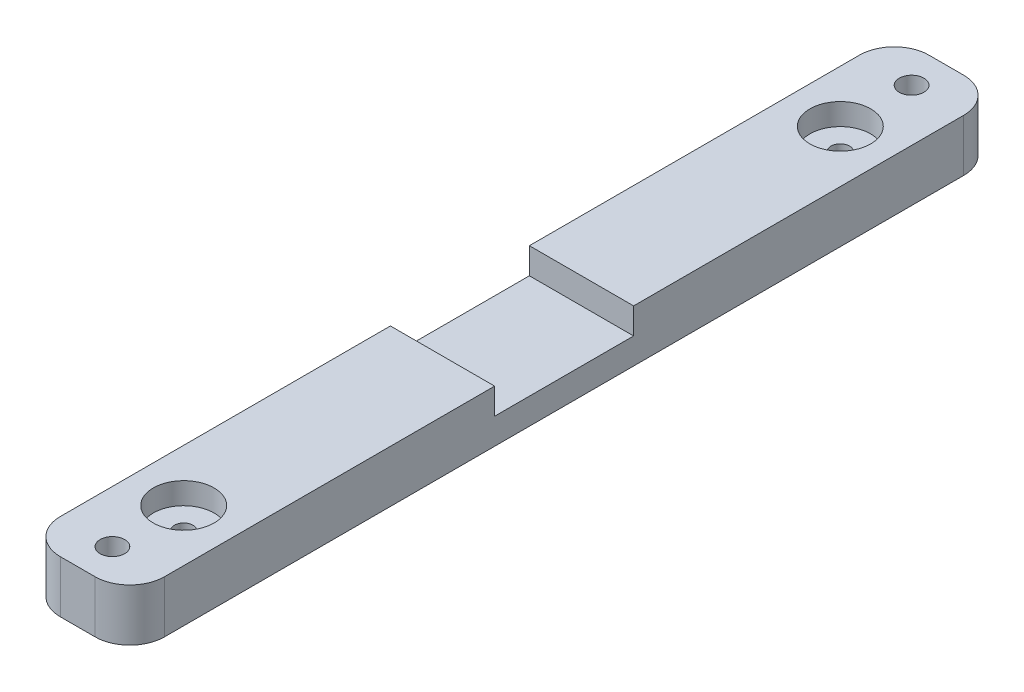
ISO-10303-21;
HEADER;
FILE_DESCRIPTION(('STEP AP214'),'2;1');
FILE_NAME('part.step','',(''),(''),'','','');
FILE_SCHEMA(('AUTOMOTIVE_DESIGN { 1 0 10303 214 1 1 1 1 }'));
ENDSEC;
DATA;
#1=APPLICATION_CONTEXT('core data for automotive mechanical design processes');
#2=APPLICATION_PROTOCOL_DEFINITION('international standard','automotive_design',2000,#1);
#3=PRODUCT_CONTEXT('',#1,'mechanical');
#4=PRODUCT('Part','Part','',(#3));
#5=PRODUCT_RELATED_PRODUCT_CATEGORY('part','',(#4));
#6=PRODUCT_DEFINITION_FORMATION('','',#4);
#7=PRODUCT_DEFINITION_CONTEXT('part definition',#1,'design');
#8=PRODUCT_DEFINITION('design','',#6,#7);
#9=PRODUCT_DEFINITION_SHAPE('','',#8);
#10=(LENGTH_UNIT() NAMED_UNIT(*) SI_UNIT(.MILLI.,.METRE.));
#11=(NAMED_UNIT(*) PLANE_ANGLE_UNIT() SI_UNIT($,.RADIAN.));
#12=(NAMED_UNIT(*) SI_UNIT($,.STERADIAN.) SOLID_ANGLE_UNIT());
#13=UNCERTAINTY_MEASURE_WITH_UNIT(LENGTH_MEASURE(1.E-05),#10,'distance_accuracy_value','');
#14=(GEOMETRIC_REPRESENTATION_CONTEXT(3) GLOBAL_UNCERTAINTY_ASSIGNED_CONTEXT((#13)) GLOBAL_UNIT_ASSIGNED_CONTEXT((#10,
#11,#12)) REPRESENTATION_CONTEXT('',''));
#15=CARTESIAN_POINT('',(0.,0.,0.));
#16=DIRECTION('',(0.,0.,1.));
#17=DIRECTION('',(1.,0.,0.));
#18=AXIS2_PLACEMENT_3D('',#15,#16,#17);
#19=CARTESIAN_POINT('',(0.,4.7625,-60.000000015));
#20=DIRECTION('',(0.,1.,0.));
#21=DIRECTION('',(0.,0.,1.));
#22=AXIS2_PLACEMENT_3D('',#19,#20,#21);
#23=CYLINDRICAL_SURFACE('',#22,1.69999999999999);
#24=CARTESIAN_POINT('',(0.,-4.7625,-60.000000015));
#25=DIRECTION('',(0.,1.,0.));
#26=DIRECTION('',(0.,0.,1.));
#27=AXIS2_PLACEMENT_3D('',#24,#25,#26);
#28=CIRCLE('',#27,1.7);
#29=CARTESIAN_POINT('',(0.,-4.7625,-58.300000015));
#30=VERTEX_POINT('',#29);
#31=EDGE_CURVE('E256',#30,#30,#28,.T.);
#32=ORIENTED_EDGE('',*,*,#31,.F.);
#33=EDGE_LOOP('',(#32));
#34=FACE_BOUND('',#33,.T.);
#35=CARTESIAN_POINT('',(0.,0.79375,-60.000000015));
#36=DIRECTION('',(0.,1.,0.));
#37=DIRECTION('',(0.,0.,1.));
#38=AXIS2_PLACEMENT_3D('',#35,#36,#37);
#39=CIRCLE('',#38,1.69999999999999);
#40=CARTESIAN_POINT('',(0.,0.79375,-58.300000015));
#41=VERTEX_POINT('',#40);
#42=EDGE_CURVE('E183',#41,#41,#39,.F.);
#43=ORIENTED_EDGE('',*,*,#42,.F.);
#44=EDGE_LOOP('',(#43));
#45=FACE_BOUND('',#44,.T.);
#46=ADVANCED_FACE('F35',(#34,#45),#23,.F.);
#47=CARTESIAN_POINT('',(0.,4.7625,60.000000015));
#48=DIRECTION('',(0.,1.,0.));
#49=DIRECTION('',(0.,0.,1.));
#50=AXIS2_PLACEMENT_3D('',#47,#48,#49);
#51=CYLINDRICAL_SURFACE('',#50,1.69999999999999);
#52=CARTESIAN_POINT('',(0.,-4.7625,60.000000015));
#53=DIRECTION('',(0.,1.,0.));
#54=DIRECTION('',(0.,0.,1.));
#55=AXIS2_PLACEMENT_3D('',#52,#53,#54);
#56=CIRCLE('',#55,1.7);
#57=CARTESIAN_POINT('',(0.,-4.7625,61.700000015));
#58=VERTEX_POINT('',#57);
#59=EDGE_CURVE('E187',#58,#58,#56,.T.);
#60=ORIENTED_EDGE('',*,*,#59,.F.);
#61=EDGE_LOOP('',(#60));
#62=FACE_BOUND('',#61,.T.);
#63=CARTESIAN_POINT('',(0.,0.79375,60.000000015));
#64=DIRECTION('',(0.,1.,0.));
#65=DIRECTION('',(0.,0.,1.));
#66=AXIS2_PLACEMENT_3D('',#63,#64,#65);
#67=CIRCLE('',#66,1.69999999999999);
#68=CARTESIAN_POINT('',(0.,0.79375,61.700000015));
#69=VERTEX_POINT('',#68);
#70=EDGE_CURVE('E180',#69,#69,#67,.F.);
#71=ORIENTED_EDGE('',*,*,#70,.F.);
#72=EDGE_LOOP('',(#71));
#73=FACE_BOUND('',#72,.T.);
#74=ADVANCED_FACE('F311',(#62,#73),#51,.F.);
#75=CARTESIAN_POINT('',(-9.525,4.7625,79.375));
#76=DIRECTION('',(0.,-1.,0.));
#77=DIRECTION('',(0.,0.,-1.));
#78=AXIS2_PLACEMENT_3D('',#75,#76,#77);
#79=PLANE('',#78);
#80=CARTESIAN_POINT('',(0.,4.7625,-73.025));
#81=DIRECTION('',(0.,1.,0.));
#82=DIRECTION('',(0.,0.,1.));
#83=AXIS2_PLACEMENT_3D('',#80,#81,#82);
#84=CIRCLE('',#83,2.2479);
#85=CARTESIAN_POINT('',(0.,4.7625,-70.7771));
#86=VERTEX_POINT('',#85);
#87=EDGE_CURVE('E277',#86,#86,#84,.T.);
#88=ORIENTED_EDGE('',*,*,#87,.F.);
#89=EDGE_LOOP('',(#88));
#90=FACE_BOUND('',#89,.T.);
#91=CARTESIAN_POINT('',(0.,4.7625,-60.000000015));
#92=DIRECTION('',(0.,1.,0.));
#93=DIRECTION('',(0.,0.,1.));
#94=AXIS2_PLACEMENT_3D('',#91,#92,#93);
#95=CIRCLE('',#94,5.55625);
#96=CARTESIAN_POINT('',(0.,4.7625,-54.443750015));
#97=VERTEX_POINT('',#96);
#98=EDGE_CURVE('E263',#97,#97,#95,.T.);
#99=ORIENTED_EDGE('',*,*,#98,.F.);
#100=EDGE_LOOP('',(#99));
#101=FACE_BOUND('',#100,.T.);
#102=DIRECTION('',(0.,0.,-1.));
#103=VECTOR('',#102,1.);
#104=CARTESIAN_POINT('',(9.525,4.7625,79.375));
#105=LINE('',#104,#103);
#106=CARTESIAN_POINT('',(9.525,4.7625,-12.7));
#107=VERTEX_POINT('',#106);
#108=CARTESIAN_POINT('',(9.525,4.7625,-73.0249999999999));
#109=VERTEX_POINT('',#108);
#110=EDGE_CURVE('E176',#107,#109,#105,.T.);
#111=ORIENTED_EDGE('',*,*,#110,.T.);
#112=CARTESIAN_POINT('',(3.175,4.7625,-73.025));
#113=DIRECTION('',(0.,-1.,0.));
#114=DIRECTION('',(0.,0.,-1.));
#115=AXIS2_PLACEMENT_3D('',#112,#113,#114);
#116=CIRCLE('',#115,6.35);
#117=CARTESIAN_POINT('',(3.175,4.7625,-79.375));
#118=VERTEX_POINT('',#117);
#119=EDGE_CURVE('E194',#109,#118,#116,.F.);
#120=ORIENTED_EDGE('',*,*,#119,.T.);
#121=DIRECTION('',(-1.,0.,0.));
#122=VECTOR('',#121,1.);
#123=CARTESIAN_POINT('',(-9.525,4.7625,-79.375));
#124=LINE('',#123,#122);
#125=CARTESIAN_POINT('',(-3.175,4.7625,-79.375));
#126=VERTEX_POINT('',#125);
#127=EDGE_CURVE('E163',#118,#126,#124,.T.);
#128=ORIENTED_EDGE('',*,*,#127,.T.);
#129=CARTESIAN_POINT('',(-3.175,4.7625,-73.025));
#130=DIRECTION('',(0.,-1.,0.));
#131=DIRECTION('',(0.,0.,-1.));
#132=AXIS2_PLACEMENT_3D('',#129,#130,#131);
#133=CIRCLE('',#132,6.35);
#134=CARTESIAN_POINT('',(-9.525,4.7625,-73.0249999999999));
#135=VERTEX_POINT('',#134);
#136=EDGE_CURVE('E192',#126,#135,#133,.F.);
#137=ORIENTED_EDGE('',*,*,#136,.T.);
#138=DIRECTION('',(0.,0.,-1.));
#139=VECTOR('',#138,1.);
#140=CARTESIAN_POINT('',(-9.525,4.7625,79.375));
#141=LINE('',#140,#139);
#142=CARTESIAN_POINT('',(-9.525,4.7625,-12.7));
#143=VERTEX_POINT('',#142);
#144=EDGE_CURVE('E174',#143,#135,#141,.T.);
#145=ORIENTED_EDGE('',*,*,#144,.F.);
#146=DIRECTION('',(-1.,0.,0.));
#147=VECTOR('',#146,1.);
#148=CARTESIAN_POINT('',(-9.525,4.7625,-12.7));
#149=LINE('',#148,#147);
#150=EDGE_CURVE('E145',#107,#143,#149,.T.);
#151=ORIENTED_EDGE('',*,*,#150,.F.);
#152=EDGE_LOOP('',(#111,#120,#128,#137,#145,#151));
#153=FACE_BOUND('',#152,.T.);
#154=ADVANCED_FACE('F239',(#90,#101,#153),#79,.F.);
#155=CARTESIAN_POINT('',(9.525,-4.7625,79.375));
#156=DIRECTION('',(-1.,0.,0.));
#157=DIRECTION('',(0.,0.,1.));
#158=AXIS2_PLACEMENT_3D('',#155,#156,#157);
#159=PLANE('',#158);
#160=DIRECTION('',(0.,0.,-1.));
#161=VECTOR('',#160,1.);
#162=CARTESIAN_POINT('',(9.525,-4.7625,79.375));
#163=LINE('',#162,#161);
#164=CARTESIAN_POINT('',(9.525,-4.7625,73.025));
#165=VERTEX_POINT('',#164);
#166=CARTESIAN_POINT('',(9.525,-4.7625,-73.0249999999999));
#167=VERTEX_POINT('',#166);
#168=EDGE_CURVE('E162',#165,#167,#163,.T.);
#169=ORIENTED_EDGE('',*,*,#168,.T.);
#170=DIRECTION('',(0.,1.,0.));
#171=VECTOR('',#170,1.);
#172=CARTESIAN_POINT('',(9.525,4.7625,-73.025));
#173=LINE('',#172,#171);
#174=EDGE_CURVE('E189',#167,#109,#173,.T.);
#175=ORIENTED_EDGE('',*,*,#174,.T.);
#176=ORIENTED_EDGE('',*,*,#110,.F.);
#177=DIRECTION('',(0.,1.,0.));
#178=VECTOR('',#177,1.);
#179=CARTESIAN_POINT('',(9.525,0.,-12.7));
#180=LINE('',#179,#178);
#181=CARTESIAN_POINT('',(9.525,0.,-12.7));
#182=VERTEX_POINT('',#181);
#183=EDGE_CURVE('E151',#182,#107,#180,.T.);
#184=ORIENTED_EDGE('',*,*,#183,.F.);
#185=DIRECTION('',(0.,0.,-1.));
#186=VECTOR('',#185,1.);
#187=CARTESIAN_POINT('',(9.525,0.,12.7));
#188=LINE('',#187,#186);
#189=CARTESIAN_POINT('',(9.525,0.,12.7));
#190=VERTEX_POINT('',#189);
#191=EDGE_CURVE('E135',#190,#182,#188,.T.);
#192=ORIENTED_EDGE('',*,*,#191,.F.);
#193=DIRECTION('',(0.,1.,0.));
#194=VECTOR('',#193,1.);
#195=CARTESIAN_POINT('',(9.525,0.,12.7));
#196=LINE('',#195,#194);
#197=CARTESIAN_POINT('',(9.525,4.7625,12.7));
#198=VERTEX_POINT('',#197);
#199=EDGE_CURVE('E132',#190,#198,#196,.T.);
#200=ORIENTED_EDGE('',*,*,#199,.T.);
#201=CARTESIAN_POINT('',(9.525,4.7625,73.025));
#202=VERTEX_POINT('',#201);
#203=EDGE_CURVE('E177',#202,#198,#105,.T.);
#204=ORIENTED_EDGE('',*,*,#203,.F.);
#205=DIRECTION('',(0.,1.,0.));
#206=VECTOR('',#205,1.);
#207=CARTESIAN_POINT('',(9.525,-4.7625,73.025));
#208=LINE('',#207,#206);
#209=EDGE_CURVE('E179',#202,#165,#208,.F.);
#210=ORIENTED_EDGE('',*,*,#209,.T.);
#211=EDGE_LOOP('',(#169,#175,#176,#184,#192,#200,#204,#210));
#212=FACE_BOUND('',#211,.T.);
#213=ADVANCED_FACE('F225',(#212),#159,.F.);
#214=CARTESIAN_POINT('',(0.,4.7625,73.025));
#215=DIRECTION('',(0.,1.,0.));
#216=DIRECTION('',(0.,0.,1.));
#217=AXIS2_PLACEMENT_3D('',#214,#215,#216);
#218=CIRCLE('',#217,2.2479);
#219=CARTESIAN_POINT('',(0.,4.7625,75.2729));
#220=VERTEX_POINT('',#219);
#221=EDGE_CURVE('E283',#220,#220,#218,.T.);
#222=ORIENTED_EDGE('',*,*,#221,.F.);
#223=EDGE_LOOP('',(#222));
#224=FACE_BOUND('',#223,.T.);
#225=CARTESIAN_POINT('',(0.,4.7625,60.000000015));
#226=DIRECTION('',(0.,1.,0.));
#227=DIRECTION('',(0.,0.,1.));
#228=AXIS2_PLACEMENT_3D('',#225,#226,#227);
#229=CIRCLE('',#228,5.55625);
#230=CARTESIAN_POINT('',(0.,4.7625,65.556250015));
#231=VERTEX_POINT('',#230);
#232=EDGE_CURVE('E270',#231,#231,#229,.T.);
#233=ORIENTED_EDGE('',*,*,#232,.F.);
#234=EDGE_LOOP('',(#233));
#235=FACE_BOUND('',#234,.T.);
#236=DIRECTION('',(-1.,0.,0.));
#237=VECTOR('',#236,1.);
#238=CARTESIAN_POINT('',(-9.525,4.7625,79.375));
#239=LINE('',#238,#237);
#240=CARTESIAN_POINT('',(3.175,4.7625,79.375));
#241=VERTEX_POINT('',#240);
#242=CARTESIAN_POINT('',(-3.175,4.7625,79.375));
#243=VERTEX_POINT('',#242);
#244=EDGE_CURVE('E156',#241,#243,#239,.T.);
#245=ORIENTED_EDGE('',*,*,#244,.F.);
#246=CARTESIAN_POINT('',(3.175,4.7625,73.025));
#247=DIRECTION('',(0.,-1.,0.));
#248=DIRECTION('',(0.,0.,-1.));
#249=AXIS2_PLACEMENT_3D('',#246,#247,#248);
#250=CIRCLE('',#249,6.35);
#251=EDGE_CURVE('E11',#241,#202,#250,.F.);
#252=ORIENTED_EDGE('',*,*,#251,.T.);
#253=ORIENTED_EDGE('',*,*,#203,.T.);
#254=DIRECTION('',(1.,0.,0.));
#255=VECTOR('',#254,1.);
#256=CARTESIAN_POINT('',(-9.525,4.7625,12.7));
#257=LINE('',#256,#255);
#258=CARTESIAN_POINT('',(-9.525,4.7625,12.7));
#259=VERTEX_POINT('',#258);
#260=EDGE_CURVE('E255',#259,#198,#257,.T.);
#261=ORIENTED_EDGE('',*,*,#260,.F.);
#262=CARTESIAN_POINT('',(-9.525,4.7625,73.025));
#263=VERTEX_POINT('',#262);
#264=EDGE_CURVE('E149',#263,#259,#141,.T.);
#265=ORIENTED_EDGE('',*,*,#264,.F.);
#266=CARTESIAN_POINT('',(-3.175,4.7625,73.025));
#267=DIRECTION('',(0.,-1.,0.));
#268=DIRECTION('',(0.,0.,-1.));
#269=AXIS2_PLACEMENT_3D('',#266,#267,#268);
#270=CIRCLE('',#269,6.35);
#271=EDGE_CURVE('E43',#263,#243,#270,.F.);
#272=ORIENTED_EDGE('',*,*,#271,.T.);
#273=EDGE_LOOP('',(#245,#252,#253,#261,#265,#272));
#274=FACE_BOUND('',#273,.T.);
#275=ADVANCED_FACE('F222',(#224,#235,#274),#79,.F.);
#276=CARTESIAN_POINT('',(-9.525,-4.7625,79.375));
#277=DIRECTION('',(1.,0.,0.));
#278=DIRECTION('',(0.,0.,-1.));
#279=AXIS2_PLACEMENT_3D('',#276,#277,#278);
#280=PLANE('',#279);
#281=ORIENTED_EDGE('',*,*,#144,.T.);
#282=DIRECTION('',(0.,-1.,0.));
#283=VECTOR('',#282,1.);
#284=CARTESIAN_POINT('',(-9.525,-4.7625,-73.025));
#285=LINE('',#284,#283);
#286=CARTESIAN_POINT('',(-9.525,-4.7625,-73.0249999999999));
#287=VERTEX_POINT('',#286);
#288=EDGE_CURVE('E210',#135,#287,#285,.T.);
#289=ORIENTED_EDGE('',*,*,#288,.T.);
#290=DIRECTION('',(0.,0.,-1.));
#291=VECTOR('',#290,1.);
#292=CARTESIAN_POINT('',(-9.525,-4.7625,79.375));
#293=LINE('',#292,#291);
#294=CARTESIAN_POINT('',(-9.525,-4.7625,73.025));
#295=VERTEX_POINT('',#294);
#296=EDGE_CURVE('E171',#295,#287,#293,.T.);
#297=ORIENTED_EDGE('',*,*,#296,.F.);
#298=DIRECTION('',(0.,-1.,0.));
#299=VECTOR('',#298,1.);
#300=CARTESIAN_POINT('',(-9.525,-4.7625,73.025));
#301=LINE('',#300,#299);
#302=EDGE_CURVE('E208',#295,#263,#301,.F.);
#303=ORIENTED_EDGE('',*,*,#302,.T.);
#304=ORIENTED_EDGE('',*,*,#264,.T.);
#305=DIRECTION('',(0.,1.,0.));
#306=VECTOR('',#305,1.);
#307=CARTESIAN_POINT('',(-9.525,0.,12.7));
#308=LINE('',#307,#306);
#309=CARTESIAN_POINT('',(-9.525,0.,12.7));
#310=VERTEX_POINT('',#309);
#311=EDGE_CURVE('E129',#310,#259,#308,.T.);
#312=ORIENTED_EDGE('',*,*,#311,.F.);
#313=DIRECTION('',(0.,0.,1.));
#314=VECTOR('',#313,1.);
#315=CARTESIAN_POINT('',(-9.525,0.,12.7));
#316=LINE('',#315,#314);
#317=CARTESIAN_POINT('',(-9.525,0.,-12.7));
#318=VERTEX_POINT('',#317);
#319=EDGE_CURVE('E136',#318,#310,#316,.T.);
#320=ORIENTED_EDGE('',*,*,#319,.F.);
#321=DIRECTION('',(0.,1.,0.));
#322=VECTOR('',#321,1.);
#323=CARTESIAN_POINT('',(-9.525,0.,-12.7));
#324=LINE('',#323,#322);
#325=EDGE_CURVE('E166',#318,#143,#324,.T.);
#326=ORIENTED_EDGE('',*,*,#325,.T.);
#327=EDGE_LOOP('',(#281,#289,#297,#303,#304,#312,#320,#326));
#328=FACE_BOUND('',#327,.T.);
#329=ADVANCED_FACE('F148',(#328),#280,.F.);
#330=CARTESIAN_POINT('',(-9.525,-4.7625,79.375));
#331=DIRECTION('',(0.,1.,0.));
#332=DIRECTION('',(0.,0.,1.));
#333=AXIS2_PLACEMENT_3D('',#330,#331,#332);
#334=PLANE('',#333);
#335=CARTESIAN_POINT('',(0.,-4.7625,73.025));
#336=DIRECTION('',(0.,1.,0.));
#337=DIRECTION('',(0.,0.,1.));
#338=AXIS2_PLACEMENT_3D('',#335,#336,#337);
#339=CIRCLE('',#338,2.2479);
#340=CARTESIAN_POINT('',(0.,-4.7625,75.2729));
#341=VERTEX_POINT('',#340);
#342=EDGE_CURVE('E280',#341,#341,#339,.T.);
#343=ORIENTED_EDGE('',*,*,#342,.T.);
#344=EDGE_LOOP('',(#343));
#345=FACE_BOUND('',#344,.T.);
#346=CARTESIAN_POINT('',(0.,-4.7625,-73.025));
#347=DIRECTION('',(0.,1.,0.));
#348=DIRECTION('',(0.,0.,1.));
#349=AXIS2_PLACEMENT_3D('',#346,#347,#348);
#350=CIRCLE('',#349,2.2479);
#351=CARTESIAN_POINT('',(0.,-4.7625,-70.7771));
#352=VERTEX_POINT('',#351);
#353=EDGE_CURVE('E267',#352,#352,#350,.T.);
#354=ORIENTED_EDGE('',*,*,#353,.T.);
#355=EDGE_LOOP('',(#354));
#356=FACE_BOUND('',#355,.T.);
#357=ORIENTED_EDGE('',*,*,#59,.T.);
#358=EDGE_LOOP('',(#357));
#359=FACE_BOUND('',#358,.T.);
#360=ORIENTED_EDGE('',*,*,#31,.T.);
#361=EDGE_LOOP('',(#360));
#362=FACE_BOUND('',#361,.T.);
#363=DIRECTION('',(1.,0.,0.));
#364=VECTOR('',#363,1.);
#365=CARTESIAN_POINT('',(-9.525,-4.7625,-79.375));
#366=LINE('',#365,#364);
#367=CARTESIAN_POINT('',(-3.175,-4.7625,-79.375));
#368=VERTEX_POINT('',#367);
#369=CARTESIAN_POINT('',(3.175,-4.7625,-79.375));
#370=VERTEX_POINT('',#369);
#371=EDGE_CURVE('E159',#368,#370,#366,.T.);
#372=ORIENTED_EDGE('',*,*,#371,.T.);
#373=CARTESIAN_POINT('',(3.175,-4.7625,-73.025));
#374=DIRECTION('',(0.,1.,0.));
#375=DIRECTION('',(0.,0.,1.));
#376=AXIS2_PLACEMENT_3D('',#373,#374,#375);
#377=CIRCLE('',#376,6.35);
#378=EDGE_CURVE('E206',#370,#167,#377,.F.);
#379=ORIENTED_EDGE('',*,*,#378,.T.);
#380=ORIENTED_EDGE('',*,*,#168,.F.);
#381=CARTESIAN_POINT('',(3.175,-4.7625,73.025));
#382=DIRECTION('',(0.,1.,0.));
#383=DIRECTION('',(0.,0.,1.));
#384=AXIS2_PLACEMENT_3D('',#381,#382,#383);
#385=CIRCLE('',#384,6.35);
#386=CARTESIAN_POINT('',(3.175,-4.7625,79.375));
#387=VERTEX_POINT('',#386);
#388=EDGE_CURVE('E202',#165,#387,#385,.F.);
#389=ORIENTED_EDGE('',*,*,#388,.T.);
#390=DIRECTION('',(1.,0.,0.));
#391=VECTOR('',#390,1.);
#392=CARTESIAN_POINT('',(-9.525,-4.7625,79.375));
#393=LINE('',#392,#391);
#394=CARTESIAN_POINT('',(-3.175,-4.7625,79.375));
#395=VERTEX_POINT('',#394);
#396=EDGE_CURVE('E158',#395,#387,#393,.T.);
#397=ORIENTED_EDGE('',*,*,#396,.F.);
#398=CARTESIAN_POINT('',(-3.175,-4.7625,73.025));
#399=DIRECTION('',(0.,1.,0.));
#400=DIRECTION('',(0.,0.,1.));
#401=AXIS2_PLACEMENT_3D('',#398,#399,#400);
#402=CIRCLE('',#401,6.35);
#403=EDGE_CURVE('E200',#395,#295,#402,.F.);
#404=ORIENTED_EDGE('',*,*,#403,.T.);
#405=ORIENTED_EDGE('',*,*,#296,.T.);
#406=CARTESIAN_POINT('',(-3.175,-4.7625,-73.025));
#407=DIRECTION('',(0.,1.,0.));
#408=DIRECTION('',(0.,0.,1.));
#409=AXIS2_PLACEMENT_3D('',#406,#407,#408);
#410=CIRCLE('',#409,6.35);
#411=EDGE_CURVE('E204',#287,#368,#410,.F.);
#412=ORIENTED_EDGE('',*,*,#411,.T.);
#413=EDGE_LOOP('',(#372,#379,#380,#389,#397,#404,#405,#412));
#414=FACE_BOUND('',#413,.T.);
#415=ADVANCED_FACE('F229',(#345,#356,#359,#362,#414),#334,.F.);
#416=CARTESIAN_POINT('',(0.,0.,79.375));
#417=DIRECTION('',(0.,0.,-1.));
#418=DIRECTION('',(-1.,0.,0.));
#419=AXIS2_PLACEMENT_3D('',#416,#417,#418);
#420=PLANE('',#419);
#421=ORIENTED_EDGE('',*,*,#396,.T.);
#422=DIRECTION('',(0.,1.,0.));
#423=VECTOR('',#422,1.);
#424=CARTESIAN_POINT('',(3.175,0.,79.375));
#425=LINE('',#424,#423);
#426=EDGE_CURVE('E216',#387,#241,#425,.T.);
#427=ORIENTED_EDGE('',*,*,#426,.T.);
#428=ORIENTED_EDGE('',*,*,#244,.T.);
#429=DIRECTION('',(0.,-1.,0.));
#430=VECTOR('',#429,1.);
#431=CARTESIAN_POINT('',(-3.175,0.,79.375));
#432=LINE('',#431,#430);
#433=EDGE_CURVE('E213',#243,#395,#432,.T.);
#434=ORIENTED_EDGE('',*,*,#433,.T.);
#435=EDGE_LOOP('',(#421,#427,#428,#434));
#436=FACE_BOUND('',#435,.T.);
#437=ADVANCED_FACE('F218',(#436),#420,.F.);
#438=CARTESIAN_POINT('',(0.,0.,-79.375));
#439=DIRECTION('',(0.,0.,-1.));
#440=DIRECTION('',(-1.,0.,0.));
#441=AXIS2_PLACEMENT_3D('',#438,#439,#440);
#442=PLANE('',#441);
#443=ORIENTED_EDGE('',*,*,#127,.F.);
#444=DIRECTION('',(0.,1.,0.));
#445=VECTOR('',#444,1.);
#446=CARTESIAN_POINT('',(3.175,-4.7625,-79.375));
#447=LINE('',#446,#445);
#448=EDGE_CURVE('E198',#118,#370,#447,.F.);
#449=ORIENTED_EDGE('',*,*,#448,.T.);
#450=ORIENTED_EDGE('',*,*,#371,.F.);
#451=DIRECTION('',(0.,-1.,0.));
#452=VECTOR('',#451,1.);
#453=CARTESIAN_POINT('',(-3.175,4.7625,-79.375));
#454=LINE('',#453,#452);
#455=EDGE_CURVE('E196',#368,#126,#454,.F.);
#456=ORIENTED_EDGE('',*,*,#455,.T.);
#457=EDGE_LOOP('',(#443,#449,#450,#456));
#458=FACE_BOUND('',#457,.T.);
#459=ADVANCED_FACE('F243',(#458),#442,.T.);
#460=CARTESIAN_POINT('',(-9.525,0.,-12.7));
#461=DIRECTION('',(0.,0.,-1.));
#462=DIRECTION('',(-1.,0.,0.));
#463=AXIS2_PLACEMENT_3D('',#460,#461,#462);
#464=PLANE('',#463);
#465=ORIENTED_EDGE('',*,*,#150,.T.);
#466=ORIENTED_EDGE('',*,*,#325,.F.);
#467=DIRECTION('',(-1.,0.,0.));
#468=VECTOR('',#467,1.);
#469=CARTESIAN_POINT('',(-9.525,0.,-12.7));
#470=LINE('',#469,#468);
#471=EDGE_CURVE('E141',#182,#318,#470,.T.);
#472=ORIENTED_EDGE('',*,*,#471,.F.);
#473=ORIENTED_EDGE('',*,*,#183,.T.);
#474=EDGE_LOOP('',(#465,#466,#472,#473));
#475=FACE_BOUND('',#474,.T.);
#476=ADVANCED_FACE('F325',(#475),#464,.F.);
#477=CARTESIAN_POINT('',(-9.525,0.,12.7));
#478=DIRECTION('',(0.,0.,1.));
#479=DIRECTION('',(1.,0.,0.));
#480=AXIS2_PLACEMENT_3D('',#477,#478,#479);
#481=PLANE('',#480);
#482=ORIENTED_EDGE('',*,*,#260,.T.);
#483=ORIENTED_EDGE('',*,*,#199,.F.);
#484=DIRECTION('',(1.,0.,0.));
#485=VECTOR('',#484,1.);
#486=CARTESIAN_POINT('',(-9.525,0.,12.7));
#487=LINE('',#486,#485);
#488=EDGE_CURVE('E124',#310,#190,#487,.T.);
#489=ORIENTED_EDGE('',*,*,#488,.F.);
#490=ORIENTED_EDGE('',*,*,#311,.T.);
#491=EDGE_LOOP('',(#482,#483,#489,#490));
#492=FACE_BOUND('',#491,.T.);
#493=ADVANCED_FACE('F127',(#492),#481,.F.);
#494=CARTESIAN_POINT('',(0.,0.,0.));
#495=DIRECTION('',(0.,-1.,0.));
#496=DIRECTION('',(0.,0.,-1.));
#497=AXIS2_PLACEMENT_3D('',#494,#495,#496);
#498=PLANE('',#497);
#499=ORIENTED_EDGE('',*,*,#319,.T.);
#500=ORIENTED_EDGE('',*,*,#488,.T.);
#501=ORIENTED_EDGE('',*,*,#191,.T.);
#502=ORIENTED_EDGE('',*,*,#471,.T.);
#503=EDGE_LOOP('',(#499,#500,#501,#502));
#504=FACE_BOUND('',#503,.T.);
#505=ADVANCED_FACE('F139',(#504),#498,.F.);
#506=CARTESIAN_POINT('',(0.,0.79375,60.000000015));
#507=DIRECTION('',(0.,1.,0.));
#508=DIRECTION('',(0.,0.,1.));
#509=AXIS2_PLACEMENT_3D('',#506,#507,#508);
#510=PLANE('',#509);
#511=CARTESIAN_POINT('',(0.,0.79375,60.000000015));
#512=DIRECTION('',(0.,1.,0.));
#513=DIRECTION('',(0.,0.,1.));
#514=AXIS2_PLACEMENT_3D('',#511,#512,#513);
#515=CIRCLE('',#514,5.55625);
#516=CARTESIAN_POINT('',(0.,0.79375,65.556250015));
#517=VERTEX_POINT('',#516);
#518=EDGE_CURVE('E184',#517,#517,#515,.T.);
#519=ORIENTED_EDGE('',*,*,#518,.T.);
#520=EDGE_LOOP('',(#519));
#521=FACE_BOUND('',#520,.T.);
#522=ORIENTED_EDGE('',*,*,#70,.T.);
#523=EDGE_LOOP('',(#522));
#524=FACE_BOUND('',#523,.T.);
#525=ADVANCED_FACE('F297',(#521,#524),#510,.T.);
#526=CARTESIAN_POINT('',(0.,0.79375,60.000000015));
#527=DIRECTION('',(0.,1.,0.));
#528=DIRECTION('',(0.,0.,1.));
#529=AXIS2_PLACEMENT_3D('',#526,#527,#528);
#530=CYLINDRICAL_SURFACE('',#529,5.55625);
#531=ORIENTED_EDGE('',*,*,#518,.F.);
#532=EDGE_LOOP('',(#531));
#533=FACE_BOUND('',#532,.T.);
#534=ORIENTED_EDGE('',*,*,#232,.T.);
#535=EDGE_LOOP('',(#534));
#536=FACE_BOUND('',#535,.T.);
#537=ADVANCED_FACE('F294',(#533,#536),#530,.F.);
#538=CARTESIAN_POINT('',(0.,0.79375,-60.000000015));
#539=DIRECTION('',(0.,1.,0.));
#540=DIRECTION('',(0.,0.,1.));
#541=AXIS2_PLACEMENT_3D('',#538,#539,#540);
#542=PLANE('',#541);
#543=CARTESIAN_POINT('',(0.,0.79375,-60.000000015));
#544=DIRECTION('',(0.,1.,0.));
#545=DIRECTION('',(0.,0.,1.));
#546=AXIS2_PLACEMENT_3D('',#543,#544,#545);
#547=CIRCLE('',#546,5.55625);
#548=CARTESIAN_POINT('',(0.,0.79375,-54.443750015));
#549=VERTEX_POINT('',#548);
#550=EDGE_CURVE('E266',#549,#549,#547,.T.);
#551=ORIENTED_EDGE('',*,*,#550,.T.);
#552=EDGE_LOOP('',(#551));
#553=FACE_BOUND('',#552,.T.);
#554=ORIENTED_EDGE('',*,*,#42,.T.);
#555=EDGE_LOOP('',(#554));
#556=FACE_BOUND('',#555,.T.);
#557=ADVANCED_FACE('F296',(#553,#556),#542,.T.);
#558=CARTESIAN_POINT('',(0.,0.79375,-60.000000015));
#559=DIRECTION('',(0.,1.,0.));
#560=DIRECTION('',(0.,0.,1.));
#561=AXIS2_PLACEMENT_3D('',#558,#559,#560);
#562=CYLINDRICAL_SURFACE('',#561,5.55625);
#563=ORIENTED_EDGE('',*,*,#550,.F.);
#564=EDGE_LOOP('',(#563));
#565=FACE_BOUND('',#564,.T.);
#566=ORIENTED_EDGE('',*,*,#98,.T.);
#567=EDGE_LOOP('',(#566));
#568=FACE_BOUND('',#567,.T.);
#569=ADVANCED_FACE('F304',(#565,#568),#562,.F.);
#570=CARTESIAN_POINT('',(0.,4.7625,-73.025));
#571=DIRECTION('',(0.,1.,0.));
#572=DIRECTION('',(0.,0.,1.));
#573=AXIS2_PLACEMENT_3D('',#570,#571,#572);
#574=CYLINDRICAL_SURFACE('',#573,2.2479);
#575=ORIENTED_EDGE('',*,*,#353,.F.);
#576=EDGE_LOOP('',(#575));
#577=FACE_BOUND('',#576,.T.);
#578=ORIENTED_EDGE('',*,*,#87,.T.);
#579=EDGE_LOOP('',(#578));
#580=FACE_BOUND('',#579,.T.);
#581=ADVANCED_FACE('F422',(#577,#580),#574,.F.);
#582=CARTESIAN_POINT('',(0.,4.7625,73.025));
#583=DIRECTION('',(0.,1.,0.));
#584=DIRECTION('',(0.,0.,1.));
#585=AXIS2_PLACEMENT_3D('',#582,#583,#584);
#586=CYLINDRICAL_SURFACE('',#585,2.2479);
#587=ORIENTED_EDGE('',*,*,#342,.F.);
#588=EDGE_LOOP('',(#587));
#589=FACE_BOUND('',#588,.T.);
#590=ORIENTED_EDGE('',*,*,#221,.T.);
#591=EDGE_LOOP('',(#590));
#592=FACE_BOUND('',#591,.T.);
#593=ADVANCED_FACE('F287',(#589,#592),#586,.F.);
#594=CARTESIAN_POINT('',(3.175,-4.7625,-73.025));
#595=DIRECTION('',(0.,-1.,0.));
#596=DIRECTION('',(0.,0.,-1.));
#597=AXIS2_PLACEMENT_3D('',#594,#595,#596);
#598=CYLINDRICAL_SURFACE('',#597,6.35);
#599=ORIENTED_EDGE('',*,*,#378,.F.);
#600=ORIENTED_EDGE('',*,*,#448,.F.);
#601=ORIENTED_EDGE('',*,*,#119,.F.);
#602=ORIENTED_EDGE('',*,*,#174,.F.);
#603=EDGE_LOOP('',(#599,#600,#601,#602));
#604=FACE_BOUND('',#603,.T.);
#605=ADVANCED_FACE('F235',(#604),#598,.T.);
#606=CARTESIAN_POINT('',(-3.175,-4.7625,-73.025));
#607=DIRECTION('',(0.,1.,0.));
#608=DIRECTION('',(0.,0.,1.));
#609=AXIS2_PLACEMENT_3D('',#606,#607,#608);
#610=CYLINDRICAL_SURFACE('',#609,6.35);
#611=ORIENTED_EDGE('',*,*,#136,.F.);
#612=ORIENTED_EDGE('',*,*,#455,.F.);
#613=ORIENTED_EDGE('',*,*,#411,.F.);
#614=ORIENTED_EDGE('',*,*,#288,.F.);
#615=EDGE_LOOP('',(#611,#612,#613,#614));
#616=FACE_BOUND('',#615,.T.);
#617=ADVANCED_FACE('F247',(#616),#610,.T.);
#618=CARTESIAN_POINT('',(3.175,0.,73.025));
#619=DIRECTION('',(0.,1.,0.));
#620=DIRECTION('',(0.,0.,1.));
#621=AXIS2_PLACEMENT_3D('',#618,#619,#620);
#622=CYLINDRICAL_SURFACE('',#621,6.35);
#623=ORIENTED_EDGE('',*,*,#388,.F.);
#624=ORIENTED_EDGE('',*,*,#209,.F.);
#625=ORIENTED_EDGE('',*,*,#251,.F.);
#626=ORIENTED_EDGE('',*,*,#426,.F.);
#627=EDGE_LOOP('',(#623,#624,#625,#626));
#628=FACE_BOUND('',#627,.T.);
#629=ADVANCED_FACE('F227',(#628),#622,.T.);
#630=CARTESIAN_POINT('',(-3.175,0.,73.025));
#631=DIRECTION('',(0.,-1.,0.));
#632=DIRECTION('',(0.,0.,-1.));
#633=AXIS2_PLACEMENT_3D('',#630,#631,#632);
#634=CYLINDRICAL_SURFACE('',#633,6.35);
#635=ORIENTED_EDGE('',*,*,#271,.F.);
#636=ORIENTED_EDGE('',*,*,#302,.F.);
#637=ORIENTED_EDGE('',*,*,#403,.F.);
#638=ORIENTED_EDGE('',*,*,#433,.F.);
#639=EDGE_LOOP('',(#635,#636,#637,#638));
#640=FACE_BOUND('',#639,.T.);
#641=ADVANCED_FACE('F37',(#640),#634,.T.);
#642=CLOSED_SHELL('',(#46,#74,#154,#213,#275,#329,#415,#437,#459,#476,#493,#505,#525,#537,#557,
#569,#581,#593,#605,#617,#629,#641));
#643=MANIFOLD_SOLID_BREP('B2',#642);
#644=ADVANCED_BREP_SHAPE_REPRESENTATION('',(#18,#643),#14);
#645=SHAPE_DEFINITION_REPRESENTATION(#9,#644);
ENDSEC;
END-ISO-10303-21;
